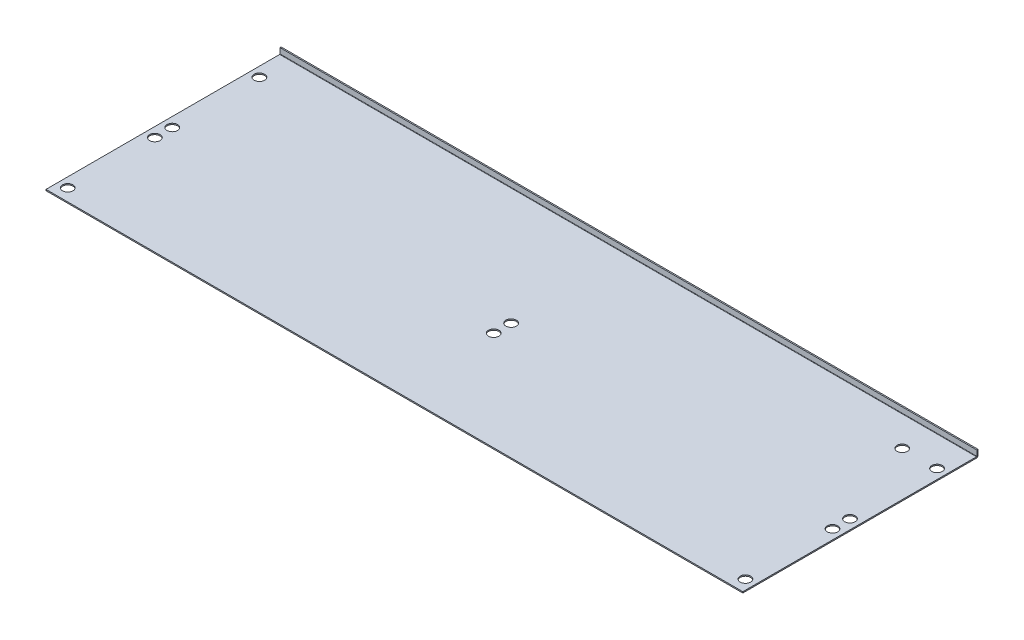
ISO-10303-21;
HEADER;
FILE_DESCRIPTION(('STEP AP214'),'2;1');
FILE_NAME('part.step','',(''),(''),'','','');
FILE_SCHEMA(('AUTOMOTIVE_DESIGN { 1 0 10303 214 1 1 1 1 }'));
ENDSEC;
DATA;
#1=APPLICATION_CONTEXT('core data for automotive mechanical design processes');
#2=APPLICATION_PROTOCOL_DEFINITION('international standard','automotive_design',2000,#1);
#3=PRODUCT_CONTEXT('',#1,'mechanical');
#4=PRODUCT('Part','Part','',(#3));
#5=PRODUCT_RELATED_PRODUCT_CATEGORY('part','',(#4));
#6=PRODUCT_DEFINITION_FORMATION('','',#4);
#7=PRODUCT_DEFINITION_CONTEXT('part definition',#1,'design');
#8=PRODUCT_DEFINITION('design','',#6,#7);
#9=PRODUCT_DEFINITION_SHAPE('','',#8);
#10=(LENGTH_UNIT() NAMED_UNIT(*) SI_UNIT(.MILLI.,.METRE.));
#11=(NAMED_UNIT(*) PLANE_ANGLE_UNIT() SI_UNIT($,.RADIAN.));
#12=(NAMED_UNIT(*) SI_UNIT($,.STERADIAN.) SOLID_ANGLE_UNIT());
#13=UNCERTAINTY_MEASURE_WITH_UNIT(LENGTH_MEASURE(1.E-05),#10,'distance_accuracy_value','');
#14=(GEOMETRIC_REPRESENTATION_CONTEXT(3) GLOBAL_UNCERTAINTY_ASSIGNED_CONTEXT((#13)) GLOBAL_UNIT_ASSIGNED_CONTEXT((#10,
#11,#12)) REPRESENTATION_CONTEXT('',''));
#15=CARTESIAN_POINT('',(0.,0.,0.));
#16=DIRECTION('',(0.,0.,1.));
#17=DIRECTION('',(1.,0.,0.));
#18=AXIS2_PLACEMENT_3D('',#15,#16,#17);
#19=CARTESIAN_POINT('',(200.,-0.7,-67.5));
#20=DIRECTION('',(1.,0.,0.));
#21=DIRECTION('',(0.,0.,-1.));
#22=AXIS2_PLACEMENT_3D('',#19,#20,#21);
#23=PLANE('',#22);
#24=DIRECTION('',(0.,0.,-1.));
#25=VECTOR('',#24,1.);
#26=CARTESIAN_POINT('',(200.,-0.7,-67.5));
#27=LINE('',#26,#25);
#28=CARTESIAN_POINT('',(200.,-0.7,67.5));
#29=VERTEX_POINT('',#28);
#30=CARTESIAN_POINT('',(200.,-0.699999999999992,-66.6));
#31=VERTEX_POINT('',#30);
#32=EDGE_CURVE('E101',#29,#31,#27,.T.);
#33=ORIENTED_EDGE('',*,*,#32,.F.);
#34=DIRECTION('',(0.,-1.,0.));
#35=VECTOR('',#34,1.);
#36=CARTESIAN_POINT('',(200.,-0.7,67.5));
#37=LINE('',#36,#35);
#38=CARTESIAN_POINT('',(200.,-1.4,67.5));
#39=VERTEX_POINT('',#38);
#40=EDGE_CURVE('E13',#29,#39,#37,.T.);
#41=ORIENTED_EDGE('',*,*,#40,.T.);
#42=DIRECTION('',(0.,0.,-1.));
#43=VECTOR('',#42,1.);
#44=CARTESIAN_POINT('',(200.,-1.4,-67.5));
#45=LINE('',#44,#43);
#46=CARTESIAN_POINT('',(200.,-1.39999999999999,-66.6));
#47=VERTEX_POINT('',#46);
#48=EDGE_CURVE('E106',#39,#47,#45,.T.);
#49=ORIENTED_EDGE('',*,*,#48,.T.);
#50=DIRECTION('',(0.,-1.,0.));
#51=VECTOR('',#50,1.);
#52=CARTESIAN_POINT('',(200.,-0.699999999999992,-66.6));
#53=LINE('',#52,#51);
#54=EDGE_CURVE('E116',#31,#47,#53,.T.);
#55=ORIENTED_EDGE('',*,*,#54,.F.);
#56=EDGE_LOOP('',(#33,#41,#49,#55));
#57=FACE_BOUND('',#56,.T.);
#58=ADVANCED_FACE('F58',(#57),#23,.T.);
#59=CARTESIAN_POINT('',(0.,-0.7,0.));
#60=DIRECTION('',(0.,-1.,0.));
#61=DIRECTION('',(0.,0.,1.));
#62=AXIS2_PLACEMENT_3D('',#59,#60,#61);
#63=PLANE('',#62);
#64=CARTESIAN_POINT('',(-194.5,-0.7,60.5));
#65=DIRECTION('',(0.,1.,0.));
#66=DIRECTION('',(0.,0.,1.));
#67=AXIS2_PLACEMENT_3D('',#64,#65,#66);
#68=CIRCLE('',#67,2.99999999999999);
#69=CARTESIAN_POINT('',(-194.5,-0.7,63.5));
#70=VERTEX_POINT('',#69);
#71=EDGE_CURVE('E113',#70,#70,#68,.T.);
#72=ORIENTED_EDGE('',*,*,#71,.F.);
#73=EDGE_LOOP('',(#72));
#74=FACE_BOUND('',#73,.T.);
#75=CARTESIAN_POINT('',(-194.5,-0.7,10.5));
#76=DIRECTION('',(0.,1.,0.));
#77=DIRECTION('',(0.,0.,1.));
#78=AXIS2_PLACEMENT_3D('',#75,#76,#77);
#79=CIRCLE('',#78,2.99999999999999);
#80=CARTESIAN_POINT('',(-194.5,-0.7,13.5));
#81=VERTEX_POINT('',#80);
#82=EDGE_CURVE('E211',#81,#81,#79,.T.);
#83=ORIENTED_EDGE('',*,*,#82,.F.);
#84=EDGE_LOOP('',(#83));
#85=FACE_BOUND('',#84,.T.);
#86=CARTESIAN_POINT('',(-194.5,-0.7,0.500000000000002));
#87=DIRECTION('',(0.,1.,0.));
#88=DIRECTION('',(0.,0.,1.));
#89=AXIS2_PLACEMENT_3D('',#86,#87,#88);
#90=CIRCLE('',#89,2.99999999999999);
#91=CARTESIAN_POINT('',(-194.5,-0.7,3.5));
#92=VERTEX_POINT('',#91);
#93=EDGE_CURVE('E205',#92,#92,#90,.T.);
#94=ORIENTED_EDGE('',*,*,#93,.F.);
#95=EDGE_LOOP('',(#94));
#96=FACE_BOUND('',#95,.T.);
#97=CARTESIAN_POINT('',(-194.5,-0.7,-49.5));
#98=DIRECTION('',(0.,1.,0.));
#99=DIRECTION('',(0.,0.,1.));
#100=AXIS2_PLACEMENT_3D('',#97,#98,#99);
#101=CIRCLE('',#100,2.99999999999999);
#102=CARTESIAN_POINT('',(-194.5,-0.7,-46.5));
#103=VERTEX_POINT('',#102);
#104=EDGE_CURVE('E199',#103,#103,#101,.T.);
#105=ORIENTED_EDGE('',*,*,#104,.F.);
#106=EDGE_LOOP('',(#105));
#107=FACE_BOUND('',#106,.T.);
#108=CARTESIAN_POINT('',(194.5,-0.7,60.5));
#109=DIRECTION('',(0.,1.,0.));
#110=DIRECTION('',(0.,0.,-1.));
#111=AXIS2_PLACEMENT_3D('',#108,#109,#110);
#112=CIRCLE('',#111,2.99999999999999);
#113=CARTESIAN_POINT('',(194.5,-0.7,57.5));
#114=VERTEX_POINT('',#113);
#115=EDGE_CURVE('E193',#114,#114,#112,.T.);
#116=ORIENTED_EDGE('',*,*,#115,.F.);
#117=EDGE_LOOP('',(#116));
#118=FACE_BOUND('',#117,.T.);
#119=CARTESIAN_POINT('',(194.5,-0.7,10.5));
#120=DIRECTION('',(0.,1.,0.));
#121=DIRECTION('',(0.,0.,-1.));
#122=AXIS2_PLACEMENT_3D('',#119,#120,#121);
#123=CIRCLE('',#122,2.99999999999999);
#124=CARTESIAN_POINT('',(194.5,-0.7,7.49999999999996));
#125=VERTEX_POINT('',#124);
#126=EDGE_CURVE('E187',#125,#125,#123,.T.);
#127=ORIENTED_EDGE('',*,*,#126,.F.);
#128=EDGE_LOOP('',(#127));
#129=FACE_BOUND('',#128,.T.);
#130=CARTESIAN_POINT('',(194.5,-0.7,0.499999999999955));
#131=DIRECTION('',(0.,1.,0.));
#132=DIRECTION('',(0.,0.,-1.));
#133=AXIS2_PLACEMENT_3D('',#130,#131,#132);
#134=CIRCLE('',#133,2.99999999999999);
#135=CARTESIAN_POINT('',(194.5,-0.7,-2.50000000000004));
#136=VERTEX_POINT('',#135);
#137=EDGE_CURVE('E181',#136,#136,#134,.T.);
#138=ORIENTED_EDGE('',*,*,#137,.F.);
#139=EDGE_LOOP('',(#138));
#140=FACE_BOUND('',#139,.T.);
#141=CARTESIAN_POINT('',(194.5,-0.7,-49.5));
#142=DIRECTION('',(0.,1.,0.));
#143=DIRECTION('',(0.,0.,-1.));
#144=AXIS2_PLACEMENT_3D('',#141,#142,#143);
#145=CIRCLE('',#144,2.99999999999999);
#146=CARTESIAN_POINT('',(194.5,-0.7,-52.5));
#147=VERTEX_POINT('',#146);
#148=EDGE_CURVE('E175',#147,#147,#145,.T.);
#149=ORIENTED_EDGE('',*,*,#148,.F.);
#150=EDGE_LOOP('',(#149));
#151=FACE_BOUND('',#150,.T.);
#152=CARTESIAN_POINT('',(0.,-0.7,10.5));
#153=DIRECTION('',(0.,1.,0.));
#154=DIRECTION('',(0.,0.,1.));
#155=AXIS2_PLACEMENT_3D('',#152,#153,#154);
#156=CIRCLE('',#155,3.);
#157=CARTESIAN_POINT('',(0.,-0.7,13.5));
#158=VERTEX_POINT('',#157);
#159=EDGE_CURVE('E169',#158,#158,#156,.T.);
#160=ORIENTED_EDGE('',*,*,#159,.F.);
#161=EDGE_LOOP('',(#160));
#162=FACE_BOUND('',#161,.T.);
#163=CARTESIAN_POINT('',(0.,-0.7,0.500000000000002));
#164=DIRECTION('',(0.,1.,0.));
#165=DIRECTION('',(0.,0.,1.));
#166=AXIS2_PLACEMENT_3D('',#163,#164,#165);
#167=CIRCLE('',#166,3.);
#168=CARTESIAN_POINT('',(0.,-0.7,3.5));
#169=VERTEX_POINT('',#168);
#170=EDGE_CURVE('E163',#169,#169,#167,.T.);
#171=ORIENTED_EDGE('',*,*,#170,.F.);
#172=EDGE_LOOP('',(#171));
#173=FACE_BOUND('',#172,.T.);
#174=CARTESIAN_POINT('',(174.5,-0.7,-49.5));
#175=DIRECTION('',(0.,1.,0.));
#176=DIRECTION('',(0.,0.,1.));
#177=AXIS2_PLACEMENT_3D('',#174,#175,#176);
#178=CIRCLE('',#177,2.99999999999999);
#179=CARTESIAN_POINT('',(174.5,-0.7,-46.5000000000001));
#180=VERTEX_POINT('',#179);
#181=EDGE_CURVE('E157',#180,#180,#178,.T.);
#182=ORIENTED_EDGE('',*,*,#181,.F.);
#183=EDGE_LOOP('',(#182));
#184=FACE_BOUND('',#183,.T.);
#185=DIRECTION('',(1.,0.,0.));
#186=VECTOR('',#185,1.);
#187=CARTESIAN_POINT('',(200.,-0.699999999999992,-66.6));
#188=LINE('',#187,#186);
#189=CARTESIAN_POINT('',(-200.,-0.699999999999992,-66.6));
#190=VERTEX_POINT('',#189);
#191=EDGE_CURVE('E150',#31,#190,#188,.F.);
#192=ORIENTED_EDGE('',*,*,#191,.T.);
#193=DIRECTION('',(0.,0.,1.));
#194=VECTOR('',#193,1.);
#195=CARTESIAN_POINT('',(-200.,-0.7,-67.5));
#196=LINE('',#195,#194);
#197=CARTESIAN_POINT('',(-200.,-0.7,67.5));
#198=VERTEX_POINT('',#197);
#199=EDGE_CURVE('E118',#190,#198,#196,.T.);
#200=ORIENTED_EDGE('',*,*,#199,.T.);
#201=DIRECTION('',(1.,0.,0.));
#202=VECTOR('',#201,1.);
#203=CARTESIAN_POINT('',(-200.,-0.7,67.5));
#204=LINE('',#203,#202);
#205=EDGE_CURVE('E81',#198,#29,#204,.T.);
#206=ORIENTED_EDGE('',*,*,#205,.T.);
#207=ORIENTED_EDGE('',*,*,#32,.T.);
#208=EDGE_LOOP('',(#192,#200,#206,#207));
#209=FACE_BOUND('',#208,.T.);
#210=ADVANCED_FACE('F235',(#74,#85,#96,#107,#118,#129,#140,#151,#162,#173,#184,#209),#63,.F.);
#211=CARTESIAN_POINT('',(0.,-1.4,0.));
#212=DIRECTION('',(0.,-1.,0.));
#213=DIRECTION('',(0.,0.,1.));
#214=AXIS2_PLACEMENT_3D('',#211,#212,#213);
#215=PLANE('',#214);
#216=CARTESIAN_POINT('',(174.5,-1.4,-49.5));
#217=DIRECTION('',(0.,1.,0.));
#218=DIRECTION('',(0.,0.,1.));
#219=AXIS2_PLACEMENT_3D('',#216,#217,#218);
#220=CIRCLE('',#219,2.99999999999999);
#221=CARTESIAN_POINT('',(174.5,-1.4,-46.5000000000001));
#222=VERTEX_POINT('',#221);
#223=EDGE_CURVE('E132',#222,#222,#220,.T.);
#224=ORIENTED_EDGE('',*,*,#223,.T.);
#225=EDGE_LOOP('',(#224));
#226=FACE_BOUND('',#225,.T.);
#227=CARTESIAN_POINT('',(0.,-1.4,0.500000000000002));
#228=DIRECTION('',(0.,1.,0.));
#229=DIRECTION('',(0.,0.,1.));
#230=AXIS2_PLACEMENT_3D('',#227,#228,#229);
#231=CIRCLE('',#230,3.);
#232=CARTESIAN_POINT('',(0.,-1.4,3.5));
#233=VERTEX_POINT('',#232);
#234=EDGE_CURVE('E160',#233,#233,#231,.T.);
#235=ORIENTED_EDGE('',*,*,#234,.T.);
#236=EDGE_LOOP('',(#235));
#237=FACE_BOUND('',#236,.T.);
#238=CARTESIAN_POINT('',(0.,-1.4,10.5));
#239=DIRECTION('',(0.,1.,0.));
#240=DIRECTION('',(0.,0.,1.));
#241=AXIS2_PLACEMENT_3D('',#238,#239,#240);
#242=CIRCLE('',#241,3.);
#243=CARTESIAN_POINT('',(0.,-1.4,13.5));
#244=VERTEX_POINT('',#243);
#245=EDGE_CURVE('E166',#244,#244,#242,.T.);
#246=ORIENTED_EDGE('',*,*,#245,.T.);
#247=EDGE_LOOP('',(#246));
#248=FACE_BOUND('',#247,.T.);
#249=CARTESIAN_POINT('',(194.5,-1.4,-49.5));
#250=DIRECTION('',(0.,1.,0.));
#251=DIRECTION('',(0.,0.,-1.));
#252=AXIS2_PLACEMENT_3D('',#249,#250,#251);
#253=CIRCLE('',#252,2.99999999999999);
#254=CARTESIAN_POINT('',(194.5,-1.4,-52.5));
#255=VERTEX_POINT('',#254);
#256=EDGE_CURVE('E172',#255,#255,#253,.T.);
#257=ORIENTED_EDGE('',*,*,#256,.T.);
#258=EDGE_LOOP('',(#257));
#259=FACE_BOUND('',#258,.T.);
#260=CARTESIAN_POINT('',(194.5,-1.4,0.499999999999955));
#261=DIRECTION('',(0.,1.,0.));
#262=DIRECTION('',(0.,0.,-1.));
#263=AXIS2_PLACEMENT_3D('',#260,#261,#262);
#264=CIRCLE('',#263,2.99999999999999);
#265=CARTESIAN_POINT('',(194.5,-1.4,-2.50000000000004));
#266=VERTEX_POINT('',#265);
#267=EDGE_CURVE('E178',#266,#266,#264,.T.);
#268=ORIENTED_EDGE('',*,*,#267,.T.);
#269=EDGE_LOOP('',(#268));
#270=FACE_BOUND('',#269,.T.);
#271=CARTESIAN_POINT('',(194.5,-1.4,10.5));
#272=DIRECTION('',(0.,1.,0.));
#273=DIRECTION('',(0.,0.,-1.));
#274=AXIS2_PLACEMENT_3D('',#271,#272,#273);
#275=CIRCLE('',#274,2.99999999999999);
#276=CARTESIAN_POINT('',(194.5,-1.4,7.49999999999996));
#277=VERTEX_POINT('',#276);
#278=EDGE_CURVE('E184',#277,#277,#275,.T.);
#279=ORIENTED_EDGE('',*,*,#278,.T.);
#280=EDGE_LOOP('',(#279));
#281=FACE_BOUND('',#280,.T.);
#282=CARTESIAN_POINT('',(194.5,-1.4,60.5));
#283=DIRECTION('',(0.,1.,0.));
#284=DIRECTION('',(0.,0.,-1.));
#285=AXIS2_PLACEMENT_3D('',#282,#283,#284);
#286=CIRCLE('',#285,2.99999999999999);
#287=CARTESIAN_POINT('',(194.5,-1.4,57.5));
#288=VERTEX_POINT('',#287);
#289=EDGE_CURVE('E190',#288,#288,#286,.T.);
#290=ORIENTED_EDGE('',*,*,#289,.T.);
#291=EDGE_LOOP('',(#290));
#292=FACE_BOUND('',#291,.T.);
#293=CARTESIAN_POINT('',(-194.5,-1.4,-49.5));
#294=DIRECTION('',(0.,1.,0.));
#295=DIRECTION('',(0.,0.,1.));
#296=AXIS2_PLACEMENT_3D('',#293,#294,#295);
#297=CIRCLE('',#296,2.99999999999999);
#298=CARTESIAN_POINT('',(-194.5,-1.4,-46.5));
#299=VERTEX_POINT('',#298);
#300=EDGE_CURVE('E196',#299,#299,#297,.T.);
#301=ORIENTED_EDGE('',*,*,#300,.T.);
#302=EDGE_LOOP('',(#301));
#303=FACE_BOUND('',#302,.T.);
#304=CARTESIAN_POINT('',(-194.5,-1.4,0.500000000000002));
#305=DIRECTION('',(0.,1.,0.));
#306=DIRECTION('',(0.,0.,1.));
#307=AXIS2_PLACEMENT_3D('',#304,#305,#306);
#308=CIRCLE('',#307,2.99999999999999);
#309=CARTESIAN_POINT('',(-194.5,-1.4,3.5));
#310=VERTEX_POINT('',#309);
#311=EDGE_CURVE('E202',#310,#310,#308,.T.);
#312=ORIENTED_EDGE('',*,*,#311,.T.);
#313=EDGE_LOOP('',(#312));
#314=FACE_BOUND('',#313,.T.);
#315=CARTESIAN_POINT('',(-194.5,-1.4,10.5));
#316=DIRECTION('',(0.,1.,0.));
#317=DIRECTION('',(0.,0.,1.));
#318=AXIS2_PLACEMENT_3D('',#315,#316,#317);
#319=CIRCLE('',#318,2.99999999999999);
#320=CARTESIAN_POINT('',(-194.5,-1.4,13.5));
#321=VERTEX_POINT('',#320);
#322=EDGE_CURVE('E208',#321,#321,#319,.T.);
#323=ORIENTED_EDGE('',*,*,#322,.T.);
#324=EDGE_LOOP('',(#323));
#325=FACE_BOUND('',#324,.T.);
#326=CARTESIAN_POINT('',(-194.5,-1.4,60.5));
#327=DIRECTION('',(0.,1.,0.));
#328=DIRECTION('',(0.,0.,1.));
#329=AXIS2_PLACEMENT_3D('',#326,#327,#328);
#330=CIRCLE('',#329,2.99999999999999);
#331=CARTESIAN_POINT('',(-194.5,-1.4,63.5));
#332=VERTEX_POINT('',#331);
#333=EDGE_CURVE('E122',#332,#332,#330,.T.);
#334=ORIENTED_EDGE('',*,*,#333,.T.);
#335=EDGE_LOOP('',(#334));
#336=FACE_BOUND('',#335,.T.);
#337=ORIENTED_EDGE('',*,*,#48,.F.);
#338=DIRECTION('',(1.,0.,0.));
#339=VECTOR('',#338,1.);
#340=CARTESIAN_POINT('',(-200.,-1.4,67.5));
#341=LINE('',#340,#339);
#342=CARTESIAN_POINT('',(-200.,-1.4,67.5));
#343=VERTEX_POINT('',#342);
#344=EDGE_CURVE('E94',#343,#39,#341,.T.);
#345=ORIENTED_EDGE('',*,*,#344,.F.);
#346=DIRECTION('',(0.,0.,1.));
#347=VECTOR('',#346,1.);
#348=CARTESIAN_POINT('',(-200.,-1.4,-67.5));
#349=LINE('',#348,#347);
#350=CARTESIAN_POINT('',(-200.,-1.4,-66.6));
#351=VERTEX_POINT('',#350);
#352=EDGE_CURVE('E102',#351,#343,#349,.T.);
#353=ORIENTED_EDGE('',*,*,#352,.F.);
#354=DIRECTION('',(1.,0.,0.));
#355=VECTOR('',#354,1.);
#356=CARTESIAN_POINT('',(200.,-1.39999999999999,-66.6));
#357=LINE('',#356,#355);
#358=EDGE_CURVE('E109',#47,#351,#357,.F.);
#359=ORIENTED_EDGE('',*,*,#358,.F.);
#360=EDGE_LOOP('',(#337,#345,#353,#359));
#361=FACE_BOUND('',#360,.T.);
#362=ADVANCED_FACE('F107',(#226,#237,#248,#259,#270,#281,#292,#303,#314,#325,#336,#361),#215,.T.);
#363=CARTESIAN_POINT('',(-200.,-0.7,67.5));
#364=DIRECTION('',(0.,0.,1.));
#365=DIRECTION('',(1.,0.,0.));
#366=AXIS2_PLACEMENT_3D('',#363,#364,#365);
#367=PLANE('',#366);
#368=ORIENTED_EDGE('',*,*,#344,.T.);
#369=ORIENTED_EDGE('',*,*,#40,.F.);
#370=ORIENTED_EDGE('',*,*,#205,.F.);
#371=DIRECTION('',(0.,-1.,0.));
#372=VECTOR('',#371,1.);
#373=CARTESIAN_POINT('',(-200.,-0.7,67.5));
#374=LINE('',#373,#372);
#375=EDGE_CURVE('E61',#198,#343,#374,.T.);
#376=ORIENTED_EDGE('',*,*,#375,.T.);
#377=EDGE_LOOP('',(#368,#369,#370,#376));
#378=FACE_BOUND('',#377,.T.);
#379=ADVANCED_FACE('F96',(#378),#367,.T.);
#380=CARTESIAN_POINT('',(-200.,-0.7,-67.5));
#381=DIRECTION('',(-1.,0.,0.));
#382=DIRECTION('',(0.,0.,1.));
#383=AXIS2_PLACEMENT_3D('',#380,#381,#382);
#384=PLANE('',#383);
#385=DIRECTION('',(0.,-1.,0.));
#386=VECTOR('',#385,1.);
#387=CARTESIAN_POINT('',(-200.,-0.699999999999992,-66.6));
#388=LINE('',#387,#386);
#389=EDGE_CURVE('E129',#190,#351,#388,.T.);
#390=ORIENTED_EDGE('',*,*,#389,.T.);
#391=ORIENTED_EDGE('',*,*,#352,.T.);
#392=ORIENTED_EDGE('',*,*,#375,.F.);
#393=ORIENTED_EDGE('',*,*,#199,.F.);
#394=EDGE_LOOP('',(#390,#391,#392,#393));
#395=FACE_BOUND('',#394,.T.);
#396=ADVANCED_FACE('F127',(#395),#384,.T.);
#397=CARTESIAN_POINT('',(-194.5,-0.7,60.5));
#398=DIRECTION('',(0.,-1.,0.));
#399=DIRECTION('',(0.,0.,1.));
#400=AXIS2_PLACEMENT_3D('',#397,#398,#399);
#401=CYLINDRICAL_SURFACE('',#400,2.99999999999999);
#402=ORIENTED_EDGE('',*,*,#71,.T.);
#403=EDGE_LOOP('',(#402));
#404=FACE_BOUND('',#403,.T.);
#405=ORIENTED_EDGE('',*,*,#333,.F.);
#406=EDGE_LOOP('',(#405));
#407=FACE_BOUND('',#406,.T.);
#408=ADVANCED_FACE('F222',(#404,#407),#401,.F.);
#409=CARTESIAN_POINT('',(-194.5,-0.7,10.5));
#410=DIRECTION('',(0.,-1.,0.));
#411=DIRECTION('',(0.,0.,1.));
#412=AXIS2_PLACEMENT_3D('',#409,#410,#411);
#413=CYLINDRICAL_SURFACE('',#412,2.99999999999999);
#414=ORIENTED_EDGE('',*,*,#82,.T.);
#415=EDGE_LOOP('',(#414));
#416=FACE_BOUND('',#415,.T.);
#417=ORIENTED_EDGE('',*,*,#322,.F.);
#418=EDGE_LOOP('',(#417));
#419=FACE_BOUND('',#418,.T.);
#420=ADVANCED_FACE('F224',(#416,#419),#413,.F.);
#421=CARTESIAN_POINT('',(-194.5,-0.7,0.500000000000002));
#422=DIRECTION('',(0.,-1.,0.));
#423=DIRECTION('',(0.,0.,1.));
#424=AXIS2_PLACEMENT_3D('',#421,#422,#423);
#425=CYLINDRICAL_SURFACE('',#424,2.99999999999999);
#426=ORIENTED_EDGE('',*,*,#93,.T.);
#427=EDGE_LOOP('',(#426));
#428=FACE_BOUND('',#427,.T.);
#429=ORIENTED_EDGE('',*,*,#311,.F.);
#430=EDGE_LOOP('',(#429));
#431=FACE_BOUND('',#430,.T.);
#432=ADVANCED_FACE('F230',(#428,#431),#425,.F.);
#433=CARTESIAN_POINT('',(-194.5,-0.7,-49.5));
#434=DIRECTION('',(0.,-1.,0.));
#435=DIRECTION('',(0.,0.,1.));
#436=AXIS2_PLACEMENT_3D('',#433,#434,#435);
#437=CYLINDRICAL_SURFACE('',#436,2.99999999999999);
#438=ORIENTED_EDGE('',*,*,#104,.T.);
#439=EDGE_LOOP('',(#438));
#440=FACE_BOUND('',#439,.T.);
#441=ORIENTED_EDGE('',*,*,#300,.F.);
#442=EDGE_LOOP('',(#441));
#443=FACE_BOUND('',#442,.T.);
#444=ADVANCED_FACE('F275',(#440,#443),#437,.F.);
#445=CARTESIAN_POINT('',(194.5,-0.7,60.5));
#446=DIRECTION('',(0.,-1.,0.));
#447=DIRECTION('',(0.,0.,1.));
#448=AXIS2_PLACEMENT_3D('',#445,#446,#447);
#449=CYLINDRICAL_SURFACE('',#448,2.99999999999999);
#450=ORIENTED_EDGE('',*,*,#115,.T.);
#451=EDGE_LOOP('',(#450));
#452=FACE_BOUND('',#451,.T.);
#453=ORIENTED_EDGE('',*,*,#289,.F.);
#454=EDGE_LOOP('',(#453));
#455=FACE_BOUND('',#454,.T.);
#456=ADVANCED_FACE('F285',(#452,#455),#449,.F.);
#457=CARTESIAN_POINT('',(194.5,-0.7,10.5));
#458=DIRECTION('',(0.,-1.,0.));
#459=DIRECTION('',(0.,0.,1.));
#460=AXIS2_PLACEMENT_3D('',#457,#458,#459);
#461=CYLINDRICAL_SURFACE('',#460,2.99999999999999);
#462=ORIENTED_EDGE('',*,*,#126,.T.);
#463=EDGE_LOOP('',(#462));
#464=FACE_BOUND('',#463,.T.);
#465=ORIENTED_EDGE('',*,*,#278,.F.);
#466=EDGE_LOOP('',(#465));
#467=FACE_BOUND('',#466,.T.);
#468=ADVANCED_FACE('F295',(#464,#467),#461,.F.);
#469=CARTESIAN_POINT('',(194.5,-0.7,0.499999999999955));
#470=DIRECTION('',(0.,-1.,0.));
#471=DIRECTION('',(0.,0.,1.));
#472=AXIS2_PLACEMENT_3D('',#469,#470,#471);
#473=CYLINDRICAL_SURFACE('',#472,2.99999999999999);
#474=ORIENTED_EDGE('',*,*,#137,.T.);
#475=EDGE_LOOP('',(#474));
#476=FACE_BOUND('',#475,.T.);
#477=ORIENTED_EDGE('',*,*,#267,.F.);
#478=EDGE_LOOP('',(#477));
#479=FACE_BOUND('',#478,.T.);
#480=ADVANCED_FACE('F305',(#476,#479),#473,.F.);
#481=CARTESIAN_POINT('',(194.5,-0.7,-49.5));
#482=DIRECTION('',(0.,-1.,0.));
#483=DIRECTION('',(0.,0.,1.));
#484=AXIS2_PLACEMENT_3D('',#481,#482,#483);
#485=CYLINDRICAL_SURFACE('',#484,2.99999999999999);
#486=ORIENTED_EDGE('',*,*,#148,.T.);
#487=EDGE_LOOP('',(#486));
#488=FACE_BOUND('',#487,.T.);
#489=ORIENTED_EDGE('',*,*,#256,.F.);
#490=EDGE_LOOP('',(#489));
#491=FACE_BOUND('',#490,.T.);
#492=ADVANCED_FACE('F315',(#488,#491),#485,.F.);
#493=CARTESIAN_POINT('',(0.,-0.7,10.5));
#494=DIRECTION('',(0.,-1.,0.));
#495=DIRECTION('',(0.,0.,1.));
#496=AXIS2_PLACEMENT_3D('',#493,#494,#495);
#497=CYLINDRICAL_SURFACE('',#496,3.);
#498=ORIENTED_EDGE('',*,*,#159,.T.);
#499=EDGE_LOOP('',(#498));
#500=FACE_BOUND('',#499,.T.);
#501=ORIENTED_EDGE('',*,*,#245,.F.);
#502=EDGE_LOOP('',(#501));
#503=FACE_BOUND('',#502,.T.);
#504=ADVANCED_FACE('F325',(#500,#503),#497,.F.);
#505=CARTESIAN_POINT('',(0.,-0.7,0.500000000000002));
#506=DIRECTION('',(0.,-1.,0.));
#507=DIRECTION('',(0.,0.,1.));
#508=AXIS2_PLACEMENT_3D('',#505,#506,#507);
#509=CYLINDRICAL_SURFACE('',#508,3.);
#510=ORIENTED_EDGE('',*,*,#170,.T.);
#511=EDGE_LOOP('',(#510));
#512=FACE_BOUND('',#511,.T.);
#513=ORIENTED_EDGE('',*,*,#234,.F.);
#514=EDGE_LOOP('',(#513));
#515=FACE_BOUND('',#514,.T.);
#516=ADVANCED_FACE('F335',(#512,#515),#509,.F.);
#517=CARTESIAN_POINT('',(174.5,-0.7,-49.5));
#518=DIRECTION('',(0.,-1.,0.));
#519=DIRECTION('',(0.,0.,1.));
#520=AXIS2_PLACEMENT_3D('',#517,#518,#519);
#521=CYLINDRICAL_SURFACE('',#520,2.99999999999999);
#522=ORIENTED_EDGE('',*,*,#181,.T.);
#523=EDGE_LOOP('',(#522));
#524=FACE_BOUND('',#523,.T.);
#525=ORIENTED_EDGE('',*,*,#223,.F.);
#526=EDGE_LOOP('',(#525));
#527=FACE_BOUND('',#526,.T.);
#528=ADVANCED_FACE('F345',(#524,#527),#521,.F.);
#529=CARTESIAN_POINT('',(-200.,-0.499999999999987,-66.6));
#530=DIRECTION('',(-1.,0.,0.));
#531=DIRECTION('',(0.,0.,1.));
#532=AXIS2_PLACEMENT_3D('',#529,#530,#531);
#533=PLANE('',#532);
#534=DIRECTION('',(0.,0.,1.));
#535=VECTOR('',#534,1.);
#536=CARTESIAN_POINT('',(-200.,-0.499999999999993,-67.5));
#537=LINE('',#536,#535);
#538=CARTESIAN_POINT('',(-200.,-0.499999999999988,-66.8));
#539=VERTEX_POINT('',#538);
#540=CARTESIAN_POINT('',(-200.,-0.499999999999991,-67.5));
#541=VERTEX_POINT('',#540);
#542=EDGE_CURVE('E146',#539,#541,#537,.F.);
#543=ORIENTED_EDGE('',*,*,#542,.T.);
#544=CARTESIAN_POINT('',(-200.,-0.499999999999987,-66.6));
#545=DIRECTION('',(-1.,0.,0.));
#546=DIRECTION('',(0.,0.,-1.));
#547=AXIS2_PLACEMENT_3D('',#544,#545,#546);
#548=CIRCLE('',#547,0.900000000000006);
#549=EDGE_CURVE('E72',#351,#541,#548,.F.);
#550=ORIENTED_EDGE('',*,*,#549,.F.);
#551=ORIENTED_EDGE('',*,*,#389,.F.);
#552=CARTESIAN_POINT('',(-200.,-0.499999999999987,-66.6));
#553=DIRECTION('',(-1.,0.,0.));
#554=DIRECTION('',(0.,0.,-1.));
#555=AXIS2_PLACEMENT_3D('',#552,#553,#554);
#556=CIRCLE('',#555,0.200000000000006);
#557=EDGE_CURVE('E143',#190,#539,#556,.F.);
#558=ORIENTED_EDGE('',*,*,#557,.T.);
#559=EDGE_LOOP('',(#543,#550,#551,#558));
#560=FACE_BOUND('',#559,.T.);
#561=ADVANCED_FACE('F355',(#560),#533,.T.);
#562=CARTESIAN_POINT('',(200.,-0.499999999999987,-66.6));
#563=DIRECTION('',(-1.,0.,0.));
#564=DIRECTION('',(0.,0.,1.));
#565=AXIS2_PLACEMENT_3D('',#562,#563,#564);
#566=PLANE('',#565);
#567=CARTESIAN_POINT('',(200.,-0.499999999999987,-66.6));
#568=DIRECTION('',(-1.,0.,0.));
#569=DIRECTION('',(0.,0.,-1.));
#570=AXIS2_PLACEMENT_3D('',#567,#568,#569);
#571=CIRCLE('',#570,0.200000000000006);
#572=CARTESIAN_POINT('',(200.,-0.499999999999988,-66.8));
#573=VERTEX_POINT('',#572);
#574=EDGE_CURVE('E152',#573,#31,#571,.T.);
#575=ORIENTED_EDGE('',*,*,#574,.T.);
#576=ORIENTED_EDGE('',*,*,#54,.T.);
#577=CARTESIAN_POINT('',(200.,-0.499999999999987,-66.6));
#578=DIRECTION('',(-1.,0.,0.));
#579=DIRECTION('',(0.,0.,-1.));
#580=AXIS2_PLACEMENT_3D('',#577,#578,#579);
#581=CIRCLE('',#580,0.900000000000006);
#582=CARTESIAN_POINT('',(200.,-0.499999999999993,-67.5));
#583=VERTEX_POINT('',#582);
#584=EDGE_CURVE('E140',#583,#47,#581,.T.);
#585=ORIENTED_EDGE('',*,*,#584,.F.);
#586=DIRECTION('',(0.,0.,1.));
#587=VECTOR('',#586,1.);
#588=CARTESIAN_POINT('',(200.,-0.499999999999988,-66.8));
#589=LINE('',#588,#587);
#590=EDGE_CURVE('E556',#573,#583,#589,.F.);
#591=ORIENTED_EDGE('',*,*,#590,.F.);
#592=EDGE_LOOP('',(#575,#576,#585,#591));
#593=FACE_BOUND('',#592,.T.);
#594=ADVANCED_FACE('F366',(#593),#566,.F.);
#595=CARTESIAN_POINT('',(200.,-0.499999999999987,-66.6));
#596=DIRECTION('',(1.,0.,0.));
#597=DIRECTION('',(0.,0.,-1.));
#598=AXIS2_PLACEMENT_3D('',#595,#596,#597);
#599=CYLINDRICAL_SURFACE('',#598,0.900000000000006);
#600=ORIENTED_EDGE('',*,*,#358,.T.);
#601=ORIENTED_EDGE('',*,*,#549,.T.);
#602=DIRECTION('',(1.,0.,0.));
#603=VECTOR('',#602,1.);
#604=CARTESIAN_POINT('',(-200.,-0.499999999999993,-67.5));
#605=LINE('',#604,#603);
#606=EDGE_CURVE('E540',#583,#541,#605,.F.);
#607=ORIENTED_EDGE('',*,*,#606,.F.);
#608=ORIENTED_EDGE('',*,*,#584,.T.);
#609=EDGE_LOOP('',(#600,#601,#607,#608));
#610=FACE_BOUND('',#609,.T.);
#611=ADVANCED_FACE('F136',(#610),#599,.T.);
#612=CARTESIAN_POINT('',(200.,-0.499999999999987,-66.6));
#613=DIRECTION('',(1.,0.,0.));
#614=DIRECTION('',(0.,0.,-1.));
#615=AXIS2_PLACEMENT_3D('',#612,#613,#614);
#616=CYLINDRICAL_SURFACE('',#615,0.200000000000006);
#617=ORIENTED_EDGE('',*,*,#191,.F.);
#618=ORIENTED_EDGE('',*,*,#574,.F.);
#619=DIRECTION('',(1.,0.,0.));
#620=VECTOR('',#619,1.);
#621=CARTESIAN_POINT('',(-200.,-0.499999999999988,-66.8));
#622=LINE('',#621,#620);
#623=EDGE_CURVE('E537',#539,#573,#622,.T.);
#624=ORIENTED_EDGE('',*,*,#623,.F.);
#625=ORIENTED_EDGE('',*,*,#557,.F.);
#626=EDGE_LOOP('',(#617,#618,#624,#625));
#627=FACE_BOUND('',#626,.T.);
#628=ADVANCED_FACE('F384',(#627),#616,.F.);
#629=CARTESIAN_POINT('',(200.,2.6,-67.5));
#630=DIRECTION('',(-1.,0.,0.));
#631=DIRECTION('',(0.,0.,1.));
#632=AXIS2_PLACEMENT_3D('',#629,#630,#631);
#633=PLANE('',#632);
#634=ORIENTED_EDGE('',*,*,#590,.T.);
#635=DIRECTION('',(0.,1.,0.));
#636=VECTOR('',#635,1.);
#637=CARTESIAN_POINT('',(200.,-1.40000000000029,-67.5));
#638=LINE('',#637,#636);
#639=CARTESIAN_POINT('',(200.,2.6,-67.5));
#640=VERTEX_POINT('',#639);
#641=EDGE_CURVE('E543',#583,#640,#638,.T.);
#642=ORIENTED_EDGE('',*,*,#641,.T.);
#643=DIRECTION('',(0.,0.,1.));
#644=VECTOR('',#643,1.);
#645=CARTESIAN_POINT('',(200.,2.6,-67.5));
#646=LINE('',#645,#644);
#647=CARTESIAN_POINT('',(200.,2.6,-66.8));
#648=VERTEX_POINT('',#647);
#649=EDGE_CURVE('E154',#640,#648,#646,.T.);
#650=ORIENTED_EDGE('',*,*,#649,.T.);
#651=DIRECTION('',(0.,-1.,0.));
#652=VECTOR('',#651,1.);
#653=CARTESIAN_POINT('',(200.,2.6,-66.8));
#654=LINE('',#653,#652);
#655=EDGE_CURVE('E531',#573,#648,#654,.F.);
#656=ORIENTED_EDGE('',*,*,#655,.F.);
#657=EDGE_LOOP('',(#634,#642,#650,#656));
#658=FACE_BOUND('',#657,.T.);
#659=ADVANCED_FACE('F393',(#658),#633,.F.);
#660=CARTESIAN_POINT('',(-200.,-0.700000000000003,-67.5));
#661=DIRECTION('',(1.,0.,0.));
#662=DIRECTION('',(0.,0.,-1.));
#663=AXIS2_PLACEMENT_3D('',#660,#661,#662);
#664=PLANE('',#663);
#665=ORIENTED_EDGE('',*,*,#542,.F.);
#666=DIRECTION('',(0.,1.,0.));
#667=VECTOR('',#666,1.);
#668=CARTESIAN_POINT('',(-200.,-0.7,-66.8));
#669=LINE('',#668,#667);
#670=CARTESIAN_POINT('',(-200.,2.6,-66.8));
#671=VERTEX_POINT('',#670);
#672=EDGE_CURVE('E530',#671,#539,#669,.F.);
#673=ORIENTED_EDGE('',*,*,#672,.F.);
#674=DIRECTION('',(0.,0.,1.));
#675=VECTOR('',#674,1.);
#676=CARTESIAN_POINT('',(-200.,2.6,-67.5));
#677=LINE('',#676,#675);
#678=CARTESIAN_POINT('',(-200.,2.6,-67.5));
#679=VERTEX_POINT('',#678);
#680=EDGE_CURVE('E525',#679,#671,#677,.T.);
#681=ORIENTED_EDGE('',*,*,#680,.F.);
#682=DIRECTION('',(0.,-1.,0.));
#683=VECTOR('',#682,1.);
#684=CARTESIAN_POINT('',(-200.,-1.40000000000029,-67.5));
#685=LINE('',#684,#683);
#686=EDGE_CURVE('E545',#679,#541,#685,.T.);
#687=ORIENTED_EDGE('',*,*,#686,.T.);
#688=EDGE_LOOP('',(#665,#673,#681,#687));
#689=FACE_BOUND('',#688,.T.);
#690=ADVANCED_FACE('F402',(#689),#664,.F.);
#691=CARTESIAN_POINT('',(0.,-1.40000000000029,-67.5));
#692=DIRECTION('',(0.,0.,1.));
#693=DIRECTION('',(0.,1.,0.));
#694=AXIS2_PLACEMENT_3D('',#691,#692,#693);
#695=PLANE('',#694);
#696=ORIENTED_EDGE('',*,*,#606,.T.);
#697=ORIENTED_EDGE('',*,*,#686,.F.);
#698=DIRECTION('',(-1.,0.,0.));
#699=VECTOR('',#698,1.);
#700=CARTESIAN_POINT('',(0.,2.6,-67.5));
#701=LINE('',#700,#699);
#702=EDGE_CURVE('E550',#640,#679,#701,.T.);
#703=ORIENTED_EDGE('',*,*,#702,.F.);
#704=ORIENTED_EDGE('',*,*,#641,.F.);
#705=EDGE_LOOP('',(#696,#697,#703,#704));
#706=FACE_BOUND('',#705,.T.);
#707=ADVANCED_FACE('F413',(#706),#695,.F.);
#708=CARTESIAN_POINT('',(0.,-1.40000000000028,-66.8));
#709=DIRECTION('',(0.,0.,1.));
#710=DIRECTION('',(0.,1.,0.));
#711=AXIS2_PLACEMENT_3D('',#708,#709,#710);
#712=PLANE('',#711);
#713=ORIENTED_EDGE('',*,*,#655,.T.);
#714=DIRECTION('',(1.,0.,0.));
#715=VECTOR('',#714,1.);
#716=CARTESIAN_POINT('',(-200.,2.6,-66.8));
#717=LINE('',#716,#715);
#718=EDGE_CURVE('E517',#648,#671,#717,.F.);
#719=ORIENTED_EDGE('',*,*,#718,.T.);
#720=ORIENTED_EDGE('',*,*,#672,.T.);
#721=ORIENTED_EDGE('',*,*,#623,.T.);
#722=EDGE_LOOP('',(#713,#719,#720,#721));
#723=FACE_BOUND('',#722,.T.);
#724=ADVANCED_FACE('F424',(#723),#712,.T.);
#725=CARTESIAN_POINT('',(-200.,2.6,-67.5));
#726=DIRECTION('',(0.,-1.,0.));
#727=DIRECTION('',(0.,0.,1.));
#728=AXIS2_PLACEMENT_3D('',#725,#726,#727);
#729=PLANE('',#728);
#730=ORIENTED_EDGE('',*,*,#718,.F.);
#731=ORIENTED_EDGE('',*,*,#649,.F.);
#732=ORIENTED_EDGE('',*,*,#702,.T.);
#733=ORIENTED_EDGE('',*,*,#680,.T.);
#734=EDGE_LOOP('',(#730,#731,#732,#733));
#735=FACE_BOUND('',#734,.T.);
#736=ADVANCED_FACE('F433',(#735),#729,.F.);
#737=CLOSED_SHELL('',(#58,#210,#362,#379,#396,#408,#420,#432,#444,#456,#468,#480,#492,#504,#516,
#528,#561,#594,#611,#628,#659,#690,#707,#724,#736));
#738=MANIFOLD_SOLID_BREP('B2',#737);
#739=ADVANCED_BREP_SHAPE_REPRESENTATION('',(#18,#738),#14);
#740=SHAPE_DEFINITION_REPRESENTATION(#9,#739);
ENDSEC;
END-ISO-10303-21;
